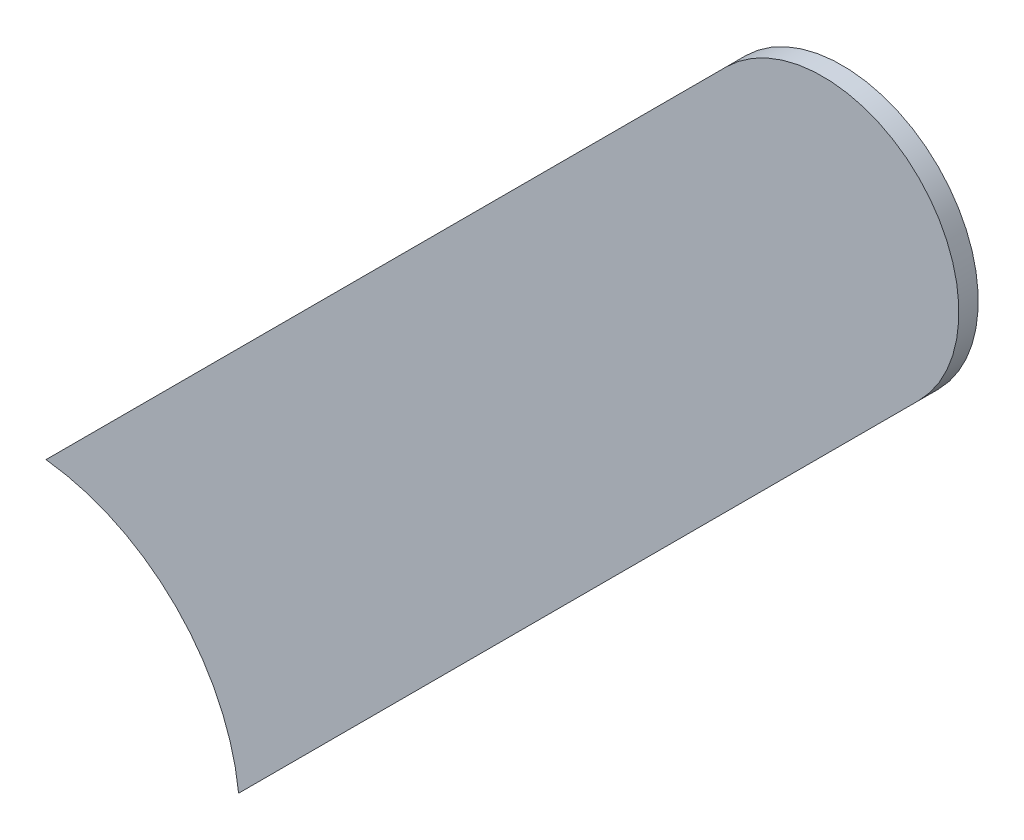
ISO-10303-21;
HEADER;
FILE_DESCRIPTION(('STEP AP214'),'2;1');
FILE_NAME('part.step','',(''),(''),'','','');
FILE_SCHEMA(('AUTOMOTIVE_DESIGN { 1 0 10303 214 1 1 1 1 }'));
ENDSEC;
DATA;
#1=APPLICATION_CONTEXT('core data for automotive mechanical design processes');
#2=APPLICATION_PROTOCOL_DEFINITION('international standard','automotive_design',2000,#1);
#3=PRODUCT_CONTEXT('',#1,'mechanical');
#4=PRODUCT('Part','Part','',(#3));
#5=PRODUCT_RELATED_PRODUCT_CATEGORY('part','',(#4));
#6=PRODUCT_DEFINITION_FORMATION('','',#4);
#7=PRODUCT_DEFINITION_CONTEXT('part definition',#1,'design');
#8=PRODUCT_DEFINITION('design','',#6,#7);
#9=PRODUCT_DEFINITION_SHAPE('','',#8);
#10=(LENGTH_UNIT() NAMED_UNIT(*) SI_UNIT(.MILLI.,.METRE.));
#11=(NAMED_UNIT(*) PLANE_ANGLE_UNIT() SI_UNIT($,.RADIAN.));
#12=(NAMED_UNIT(*) SI_UNIT($,.STERADIAN.) SOLID_ANGLE_UNIT());
#13=UNCERTAINTY_MEASURE_WITH_UNIT(LENGTH_MEASURE(1.E-05),#10,'distance_accuracy_value','');
#14=(GEOMETRIC_REPRESENTATION_CONTEXT(3) GLOBAL_UNCERTAINTY_ASSIGNED_CONTEXT((#13)) GLOBAL_UNIT_ASSIGNED_CONTEXT((#10,
#11,#12)) REPRESENTATION_CONTEXT('',''));
#15=CARTESIAN_POINT('',(0.,0.,0.));
#16=DIRECTION('',(0.,0.,1.));
#17=DIRECTION('',(1.,0.,0.));
#18=AXIS2_PLACEMENT_3D('',#15,#16,#17);
#19=CARTESIAN_POINT('',(74.7975735294402,83.0040239694402,0.));
#20=DIRECTION('',(-0.707106781186548,0.707106781186548,0.));
#21=DIRECTION('',(0.707106781186548,0.707106781186548,0.));
#22=AXIS2_PLACEMENT_3D('',#19,#20,#21);
#23=PLANE('',#22);
#24=DIRECTION('',(0.707106781186548,0.707106781186548,0.));
#25=VECTOR('',#24,1.);
#26=CARTESIAN_POINT('',(74.57677998,82.78323042,0.03556));
#27=LINE('',#26,#25);
#28=CARTESIAN_POINT('',(74.7975735294402,83.0040239694402,0.03556));
#29=VERTEX_POINT('',#28);
#30=CARTESIAN_POINT('',(76.04637318,84.25282362,0.03556));
#31=VERTEX_POINT('',#30);
#32=EDGE_CURVE('E11',#29,#31,#27,.T.);
#33=ORIENTED_EDGE('',*,*,#32,.F.);
#34=DIRECTION('',(0.,0.,1.));
#35=VECTOR('',#34,1.);
#36=CARTESIAN_POINT('',(74.7975735294402,83.0040239694402,0.));
#37=LINE('',#36,#35);
#38=CARTESIAN_POINT('',(74.7975735294402,83.0040239694402,0.));
#39=VERTEX_POINT('',#38);
#40=EDGE_CURVE('E24',#39,#29,#37,.T.);
#41=ORIENTED_EDGE('',*,*,#40,.F.);
#42=DIRECTION('',(0.707106781186548,0.707106781186548,0.));
#43=VECTOR('',#42,1.);
#44=CARTESIAN_POINT('',(74.57677998,82.78323042,0.));
#45=LINE('',#44,#43);
#46=CARTESIAN_POINT('',(76.04637318,84.25282362,0.));
#47=VERTEX_POINT('',#46);
#48=EDGE_CURVE('E75',#39,#47,#45,.T.);
#49=ORIENTED_EDGE('',*,*,#48,.T.);
#50=DIRECTION('',(0.,0.,1.));
#51=VECTOR('',#50,1.);
#52=CARTESIAN_POINT('',(76.04637318,84.25282362,0.));
#53=LINE('',#52,#51);
#54=EDGE_CURVE('E37',#47,#31,#53,.T.);
#55=ORIENTED_EDGE('',*,*,#54,.T.);
#56=EDGE_LOOP('',(#33,#41,#49,#55));
#57=FACE_BOUND('',#56,.T.);
#58=ADVANCED_FACE('F17',(#57),#23,.F.);
#59=CARTESIAN_POINT('',(75.8695968,84.4296,0.));
#60=DIRECTION('',(0.,0.,-1.));
#61=DIRECTION('',(0.707106781186548,-0.707106781186548,0.));
#62=AXIS2_PLACEMENT_3D('',#59,#60,#61);
#63=CYLINDRICAL_SURFACE('',#62,0.249999554103226);
#64=CARTESIAN_POINT('',(75.8695968,84.4296,0.03556));
#65=DIRECTION('',(0.,0.,1.));
#66=DIRECTION('',(0.707106781186548,-0.707106781186548,0.));
#67=AXIS2_PLACEMENT_3D('',#64,#65,#66);
#68=CIRCLE('',#67,0.249999554103226);
#69=CARTESIAN_POINT('',(75.69282042,84.60637638,0.03556));
#70=VERTEX_POINT('',#69);
#71=EDGE_CURVE('E83',#31,#70,#68,.T.);
#72=ORIENTED_EDGE('',*,*,#71,.F.);
#73=ORIENTED_EDGE('',*,*,#54,.F.);
#74=CARTESIAN_POINT('',(75.8695968,84.4296,0.));
#75=DIRECTION('',(0.,0.,1.));
#76=DIRECTION('',(0.707106781186548,-0.707106781186548,0.));
#77=AXIS2_PLACEMENT_3D('',#74,#75,#76);
#78=CIRCLE('',#77,0.249999554103226);
#79=CARTESIAN_POINT('',(75.69282042,84.60637638,0.));
#80=VERTEX_POINT('',#79);
#81=EDGE_CURVE('E81',#47,#80,#78,.T.);
#82=ORIENTED_EDGE('',*,*,#81,.T.);
#83=DIRECTION('',(0.,0.,1.));
#84=VECTOR('',#83,1.);
#85=CARTESIAN_POINT('',(75.69282042,84.60637638,0.));
#86=LINE('',#85,#84);
#87=EDGE_CURVE('E67',#80,#70,#86,.T.);
#88=ORIENTED_EDGE('',*,*,#87,.T.);
#89=EDGE_LOOP('',(#72,#73,#82,#88));
#90=FACE_BOUND('',#89,.T.);
#91=ADVANCED_FACE('F89',(#90),#63,.T.);
#92=CARTESIAN_POINT('',(75.69282042,84.60637638,0.));
#93=DIRECTION('',(0.707106781186551,-0.707106781186544,0.));
#94=DIRECTION('',(-0.707106781186544,-0.707106781186551,0.));
#95=AXIS2_PLACEMENT_3D('',#92,#93,#94);
#96=PLANE('',#95);
#97=DIRECTION('',(-0.707106781186544,-0.707106781186551,0.));
#98=VECTOR('',#97,1.);
#99=CARTESIAN_POINT('',(75.69282042,84.60637638,0.03556));
#100=LINE('',#99,#98);
#101=CARTESIAN_POINT('',(74.4440207694402,83.3575767294402,0.03556));
#102=VERTEX_POINT('',#101);
#103=EDGE_CURVE('E71',#70,#102,#100,.T.);
#104=ORIENTED_EDGE('',*,*,#103,.F.);
#105=ORIENTED_EDGE('',*,*,#87,.F.);
#106=DIRECTION('',(-0.707106781186544,-0.707106781186551,0.));
#107=VECTOR('',#106,1.);
#108=CARTESIAN_POINT('',(75.69282042,84.60637638,0.));
#109=LINE('',#108,#107);
#110=CARTESIAN_POINT('',(74.4440207694402,83.3575767294402,0.));
#111=VERTEX_POINT('',#110);
#112=EDGE_CURVE('E63',#80,#111,#109,.T.);
#113=ORIENTED_EDGE('',*,*,#112,.T.);
#114=DIRECTION('',(0.,0.,1.));
#115=VECTOR('',#114,1.);
#116=CARTESIAN_POINT('',(74.4440207694402,83.3575767294402,0.));
#117=LINE('',#116,#115);
#118=EDGE_CURVE('E53',#111,#102,#117,.T.);
#119=ORIENTED_EDGE('',*,*,#118,.T.);
#120=EDGE_LOOP('',(#104,#105,#113,#119));
#121=FACE_BOUND('',#120,.T.);
#122=ADVANCED_FACE('F66',(#121),#96,.F.);
#123=CARTESIAN_POINT('',(74.4000036,82.9600068,0.));
#124=DIRECTION('',(0.,0.,-1.));
#125=DIRECTION('',(1.,0.,0.));
#126=AXIS2_PLACEMENT_3D('',#123,#124,#125);
#127=CYLINDRICAL_SURFACE('',#126,0.3999992);
#128=ORIENTED_EDGE('',*,*,#40,.T.);
#129=CARTESIAN_POINT('',(74.4000036,82.9600068,0.03556));
#130=DIRECTION('',(0.,0.,1.));
#131=DIRECTION('',(1.,0.,0.));
#132=AXIS2_PLACEMENT_3D('',#129,#130,#131);
#133=CIRCLE('',#132,0.3999992);
#134=EDGE_CURVE('E59',#29,#102,#133,.T.);
#135=ORIENTED_EDGE('',*,*,#134,.T.);
#136=ORIENTED_EDGE('',*,*,#118,.F.);
#137=CARTESIAN_POINT('',(74.4000036,82.9600068,0.));
#138=DIRECTION('',(0.,0.,1.));
#139=DIRECTION('',(1.,0.,0.));
#140=AXIS2_PLACEMENT_3D('',#137,#138,#139);
#141=CIRCLE('',#140,0.3999992);
#142=EDGE_CURVE('E57',#39,#111,#141,.T.);
#143=ORIENTED_EDGE('',*,*,#142,.F.);
#144=EDGE_LOOP('',(#128,#135,#136,#143));
#145=FACE_BOUND('',#144,.T.);
#146=ADVANCED_FACE('F55',(#145),#127,.F.);
#147=CARTESIAN_POINT('',(74.57677998,82.78323042,0.));
#148=DIRECTION('',(0.,0.,-1.));
#149=DIRECTION('',(-1.,0.,0.));
#150=AXIS2_PLACEMENT_3D('',#147,#148,#149);
#151=PLANE('',#150);
#152=ORIENTED_EDGE('',*,*,#48,.F.);
#153=ORIENTED_EDGE('',*,*,#142,.T.);
#154=ORIENTED_EDGE('',*,*,#112,.F.);
#155=ORIENTED_EDGE('',*,*,#81,.F.);
#156=EDGE_LOOP('',(#152,#153,#154,#155));
#157=FACE_BOUND('',#156,.T.);
#158=ADVANCED_FACE('F74',(#157),#151,.T.);
#159=CARTESIAN_POINT('',(74.57677998,82.78323042,0.03556));
#160=DIRECTION('',(0.,0.,-1.));
#161=DIRECTION('',(-1.,0.,0.));
#162=AXIS2_PLACEMENT_3D('',#159,#160,#161);
#163=PLANE('',#162);
#164=ORIENTED_EDGE('',*,*,#134,.F.);
#165=ORIENTED_EDGE('',*,*,#32,.T.);
#166=ORIENTED_EDGE('',*,*,#71,.T.);
#167=ORIENTED_EDGE('',*,*,#103,.T.);
#168=EDGE_LOOP('',(#164,#165,#166,#167));
#169=FACE_BOUND('',#168,.T.);
#170=ADVANCED_FACE('F91',(#169),#163,.F.);
#171=CLOSED_SHELL('',(#58,#91,#122,#146,#158,#170));
#172=MANIFOLD_SOLID_BREP('B1',#171);
#173=ADVANCED_BREP_SHAPE_REPRESENTATION('',(#18,#172),#14);
#174=SHAPE_DEFINITION_REPRESENTATION(#9,#173);
ENDSEC;
END-ISO-10303-21;
